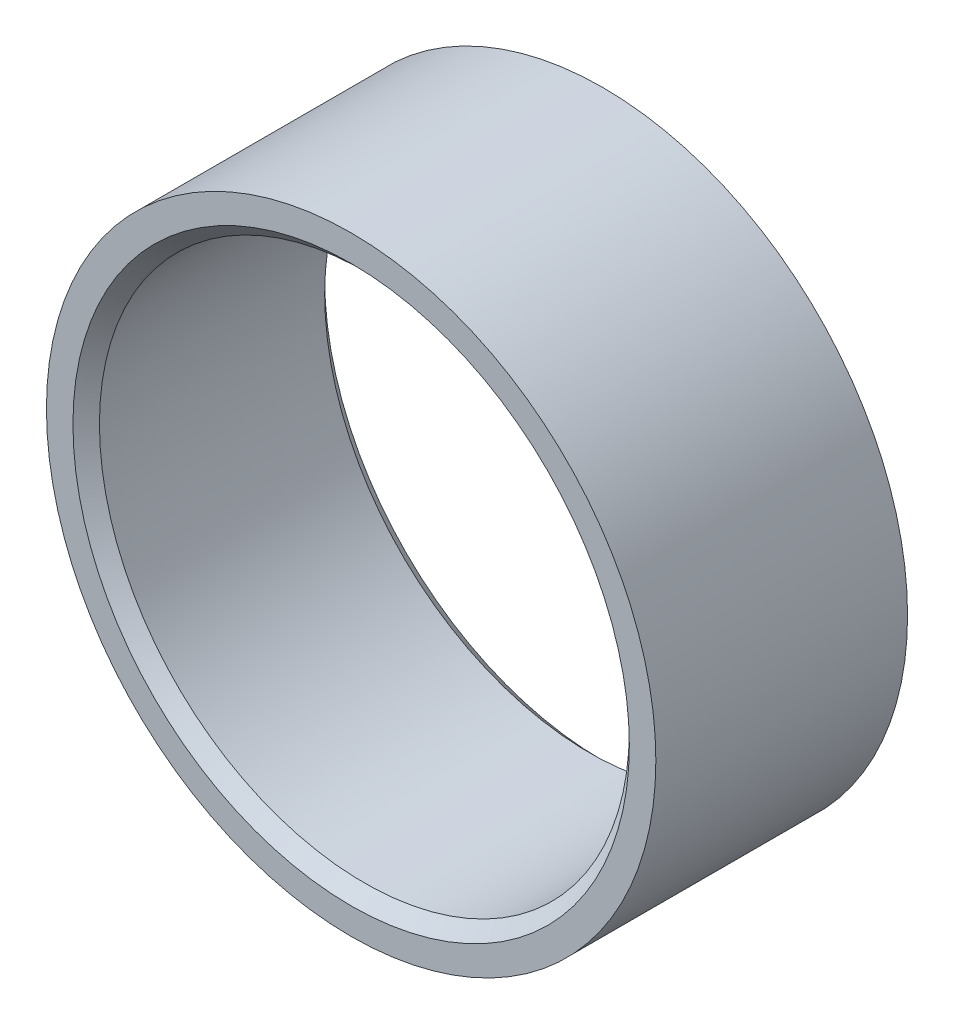
ISO-10303-21;
HEADER;
FILE_DESCRIPTION(('STEP AP214'),'2;1');
FILE_NAME('part.step','',(''),(''),'','','');
FILE_SCHEMA(('AUTOMOTIVE_DESIGN { 1 0 10303 214 1 1 1 1 }'));
ENDSEC;
DATA;
#1=APPLICATION_CONTEXT('core data for automotive mechanical design processes');
#2=APPLICATION_PROTOCOL_DEFINITION('international standard','automotive_design',2000,#1);
#3=PRODUCT_CONTEXT('',#1,'mechanical');
#4=PRODUCT('Part','Part','',(#3));
#5=PRODUCT_RELATED_PRODUCT_CATEGORY('part','',(#4));
#6=PRODUCT_DEFINITION_FORMATION('','',#4);
#7=PRODUCT_DEFINITION_CONTEXT('part definition',#1,'design');
#8=PRODUCT_DEFINITION('design','',#6,#7);
#9=PRODUCT_DEFINITION_SHAPE('','',#8);
#10=(LENGTH_UNIT() NAMED_UNIT(*) SI_UNIT(.MILLI.,.METRE.));
#11=(NAMED_UNIT(*) PLANE_ANGLE_UNIT() SI_UNIT($,.RADIAN.));
#12=(NAMED_UNIT(*) SI_UNIT($,.STERADIAN.) SOLID_ANGLE_UNIT());
#13=UNCERTAINTY_MEASURE_WITH_UNIT(LENGTH_MEASURE(1.E-05),#10,'distance_accuracy_value','');
#14=(GEOMETRIC_REPRESENTATION_CONTEXT(3) GLOBAL_UNCERTAINTY_ASSIGNED_CONTEXT((#13)) GLOBAL_UNIT_ASSIGNED_CONTEXT((#10,
#11,#12)) REPRESENTATION_CONTEXT('',''));
#15=CARTESIAN_POINT('',(0.,0.,0.));
#16=DIRECTION('',(0.,0.,1.));
#17=DIRECTION('',(1.,0.,0.));
#18=AXIS2_PLACEMENT_3D('',#15,#16,#17);
#19=CARTESIAN_POINT('',(0.,0.,9.5));
#20=DIRECTION('',(0.,0.,1.));
#21=DIRECTION('',(1.,0.,0.));
#22=AXIS2_PLACEMENT_3D('',#19,#20,#21);
#23=PLANE('',#22);
#24=CARTESIAN_POINT('',(0.,0.,9.5));
#25=DIRECTION('',(0.,0.,1.));
#26=DIRECTION('',(1.,0.,0.));
#27=AXIS2_PLACEMENT_3D('',#24,#25,#26);
#28=CIRCLE('',#27,10.5);
#29=CARTESIAN_POINT('',(10.5,0.,9.5));
#30=VERTEX_POINT('',#29);
#31=EDGE_CURVE('E10',#30,#30,#28,.F.);
#32=ORIENTED_EDGE('',*,*,#31,.T.);
#33=EDGE_LOOP('',(#32));
#34=FACE_BOUND('',#33,.T.);
#35=CARTESIAN_POINT('',(0.,0.,9.5));
#36=DIRECTION('',(0.,0.,1.));
#37=DIRECTION('',(1.,0.,0.));
#38=AXIS2_PLACEMENT_3D('',#35,#36,#37);
#39=CIRCLE('',#38,11.5);
#40=CARTESIAN_POINT('',(11.5,0.,9.5));
#41=VERTEX_POINT('',#40);
#42=EDGE_CURVE('E53',#41,#41,#39,.T.);
#43=ORIENTED_EDGE('',*,*,#42,.T.);
#44=EDGE_LOOP('',(#43));
#45=FACE_BOUND('',#44,.T.);
#46=ADVANCED_FACE('F33',(#34,#45),#23,.T.);
#47=CARTESIAN_POINT('',(0.,0.,0.));
#48=DIRECTION('',(0.,0.,1.));
#49=DIRECTION('',(1.,0.,0.));
#50=AXIS2_PLACEMENT_3D('',#47,#48,#49);
#51=PLANE('',#50);
#52=CARTESIAN_POINT('',(0.,0.,0.));
#53=DIRECTION('',(0.,0.,1.));
#54=DIRECTION('',(1.,0.,0.));
#55=AXIS2_PLACEMENT_3D('',#52,#53,#54);
#56=CIRCLE('',#55,10.5);
#57=CARTESIAN_POINT('',(10.5,0.,0.));
#58=VERTEX_POINT('',#57);
#59=EDGE_CURVE('E48',#58,#58,#56,.T.);
#60=ORIENTED_EDGE('',*,*,#59,.T.);
#61=EDGE_LOOP('',(#60));
#62=FACE_BOUND('',#61,.T.);
#63=CARTESIAN_POINT('',(0.,0.,0.));
#64=DIRECTION('',(0.,0.,1.));
#65=DIRECTION('',(1.,0.,0.));
#66=AXIS2_PLACEMENT_3D('',#63,#64,#65);
#67=CIRCLE('',#66,11.5);
#68=CARTESIAN_POINT('',(11.5,0.,0.));
#69=VERTEX_POINT('',#68);
#70=EDGE_CURVE('E54',#69,#69,#67,.T.);
#71=ORIENTED_EDGE('',*,*,#70,.F.);
#72=EDGE_LOOP('',(#71));
#73=FACE_BOUND('',#72,.T.);
#74=ADVANCED_FACE('F65',(#62,#73),#51,.F.);
#75=CARTESIAN_POINT('',(0.,0.,9.5));
#76=DIRECTION('',(0.,0.,-1.));
#77=DIRECTION('',(-1.,0.,0.));
#78=AXIS2_PLACEMENT_3D('',#75,#76,#77);
#79=CYLINDRICAL_SURFACE('',#78,11.5);
#80=ORIENTED_EDGE('',*,*,#42,.F.);
#81=EDGE_LOOP('',(#80));
#82=FACE_BOUND('',#81,.T.);
#83=ORIENTED_EDGE('',*,*,#70,.T.);
#84=EDGE_LOOP('',(#83));
#85=FACE_BOUND('',#84,.T.);
#86=ADVANCED_FACE('F61',(#82,#85),#79,.T.);
#87=CARTESIAN_POINT('',(0.,0.,9.5));
#88=DIRECTION('',(0.,0.,-1.));
#89=DIRECTION('',(-1.,0.,0.));
#90=AXIS2_PLACEMENT_3D('',#87,#88,#89);
#91=CYLINDRICAL_SURFACE('',#90,10.);
#92=CARTESIAN_POINT('',(0.,0.,0.499999999999997));
#93=DIRECTION('',(0.,0.,1.));
#94=DIRECTION('',(1.,0.,0.));
#95=AXIS2_PLACEMENT_3D('',#92,#93,#94);
#96=CIRCLE('',#95,10.);
#97=CARTESIAN_POINT('',(10.,0.,0.499999999999997));
#98=VERTEX_POINT('',#97);
#99=EDGE_CURVE('E40',#98,#98,#96,.F.);
#100=ORIENTED_EDGE('',*,*,#99,.T.);
#101=EDGE_LOOP('',(#100));
#102=FACE_BOUND('',#101,.T.);
#103=CARTESIAN_POINT('',(0.,0.,9.));
#104=DIRECTION('',(0.,0.,1.));
#105=DIRECTION('',(1.,0.,0.));
#106=AXIS2_PLACEMENT_3D('',#103,#104,#105);
#107=CIRCLE('',#106,10.);
#108=CARTESIAN_POINT('',(10.,0.,9.));
#109=VERTEX_POINT('',#108);
#110=EDGE_CURVE('E44',#109,#109,#107,.T.);
#111=ORIENTED_EDGE('',*,*,#110,.T.);
#112=EDGE_LOOP('',(#111));
#113=FACE_BOUND('',#112,.T.);
#114=ADVANCED_FACE('F64',(#102,#113),#91,.F.);
#115=CARTESIAN_POINT('',(0.,0.,0.));
#116=DIRECTION('',(0.,0.,-1.));
#117=DIRECTION('',(-1.,0.,0.));
#118=AXIS2_PLACEMENT_3D('',#115,#116,#117);
#119=CONICAL_SURFACE('',#118,10.5,0.785398163397448);
#120=ORIENTED_EDGE('',*,*,#99,.F.);
#121=EDGE_LOOP('',(#120));
#122=FACE_BOUND('',#121,.T.);
#123=ORIENTED_EDGE('',*,*,#59,.F.);
#124=EDGE_LOOP('',(#123));
#125=FACE_BOUND('',#124,.T.);
#126=ADVANCED_FACE('F78',(#122,#125),#119,.F.);
#127=CARTESIAN_POINT('',(0.,0.,9.));
#128=DIRECTION('',(0.,0.,1.));
#129=DIRECTION('',(1.,0.,0.));
#130=AXIS2_PLACEMENT_3D('',#127,#128,#129);
#131=CONICAL_SURFACE('',#130,10.,0.785398163397452);
#132=ORIENTED_EDGE('',*,*,#31,.F.);
#133=EDGE_LOOP('',(#132));
#134=FACE_BOUND('',#133,.T.);
#135=ORIENTED_EDGE('',*,*,#110,.F.);
#136=EDGE_LOOP('',(#135));
#137=FACE_BOUND('',#136,.T.);
#138=ADVANCED_FACE('F35',(#134,#137),#131,.F.);
#139=CLOSED_SHELL('',(#46,#74,#86,#114,#126,#138));
#140=MANIFOLD_SOLID_BREP('B2',#139);
#141=ADVANCED_BREP_SHAPE_REPRESENTATION('',(#18,#140),#14);
#142=SHAPE_DEFINITION_REPRESENTATION(#9,#141);
ENDSEC;
END-ISO-10303-21;
